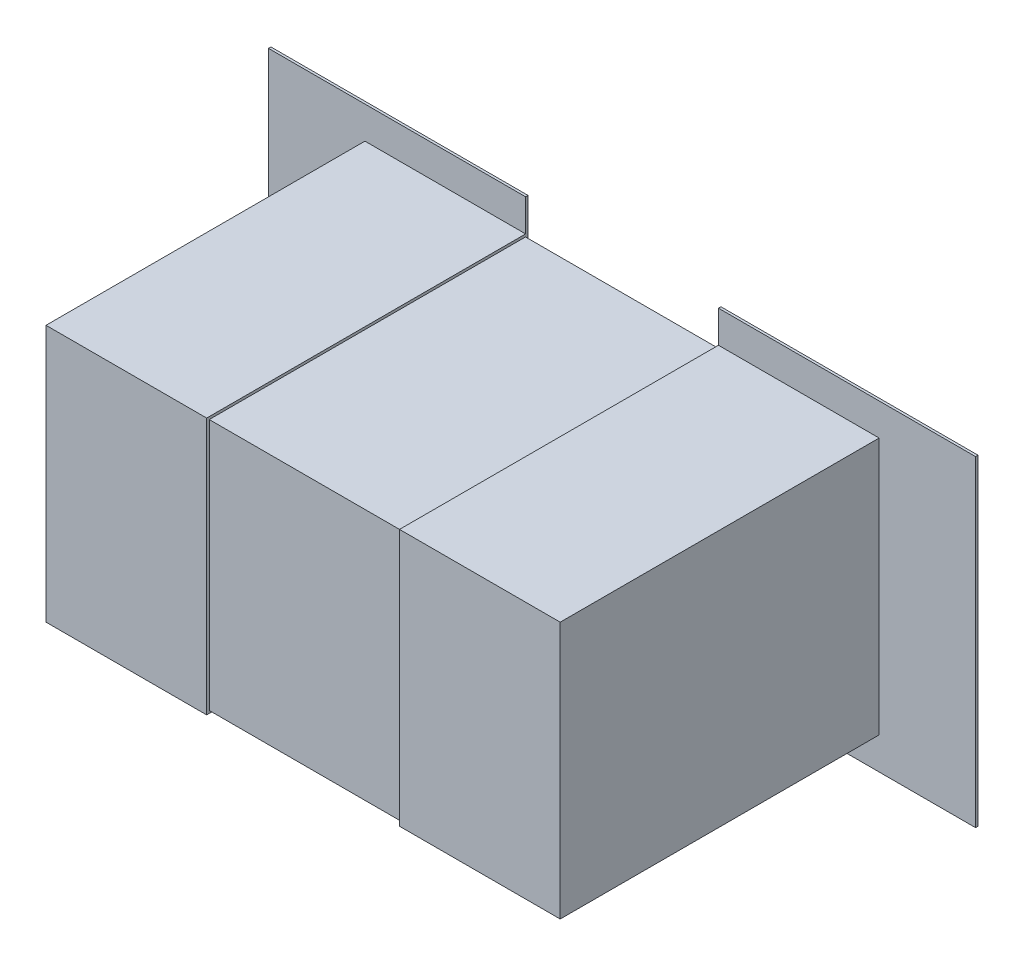
ISO-10303-21;
HEADER;
FILE_DESCRIPTION(('STEP AP214'),'2;1');
FILE_NAME('part.step','',(''),(''),'','','');
FILE_SCHEMA(('AUTOMOTIVE_DESIGN { 1 0 10303 214 1 1 1 1 }'));
ENDSEC;
DATA;
#1=APPLICATION_CONTEXT('core data for automotive mechanical design processes');
#2=APPLICATION_PROTOCOL_DEFINITION('international standard','automotive_design',2000,#1);
#3=PRODUCT_CONTEXT('',#1,'mechanical');
#4=PRODUCT('Part','Part','',(#3));
#5=PRODUCT_RELATED_PRODUCT_CATEGORY('part','',(#4));
#6=PRODUCT_DEFINITION_FORMATION('','',#4);
#7=PRODUCT_DEFINITION_CONTEXT('part definition',#1,'design');
#8=PRODUCT_DEFINITION('design','',#6,#7);
#9=PRODUCT_DEFINITION_SHAPE('','',#8);
#10=(LENGTH_UNIT() NAMED_UNIT(*) SI_UNIT(.MILLI.,.METRE.));
#11=(NAMED_UNIT(*) PLANE_ANGLE_UNIT() SI_UNIT($,.RADIAN.));
#12=(NAMED_UNIT(*) SI_UNIT($,.STERADIAN.) SOLID_ANGLE_UNIT());
#13=UNCERTAINTY_MEASURE_WITH_UNIT(LENGTH_MEASURE(1.E-05),#10,'distance_accuracy_value','');
#14=(GEOMETRIC_REPRESENTATION_CONTEXT(3) GLOBAL_UNCERTAINTY_ASSIGNED_CONTEXT((#13)) GLOBAL_UNIT_ASSIGNED_CONTEXT((#10,
#11,#12)) REPRESENTATION_CONTEXT('',''));
#15=CARTESIAN_POINT('',(0.,0.,0.));
#16=DIRECTION('',(0.,0.,1.));
#17=DIRECTION('',(1.,0.,0.));
#18=AXIS2_PLACEMENT_3D('',#15,#16,#17);
#19=CARTESIAN_POINT('',(0.800000000000102,-0.399999999999924,0.0762));
#20=DIRECTION('',(1.,0.,0.));
#21=DIRECTION('',(0.,0.,-1.));
#22=AXIS2_PLACEMENT_3D('',#19,#20,#21);
#23=PLANE('',#22);
#24=DIRECTION('',(0.,0.,-1.));
#25=VECTOR('',#24,1.);
#26=CARTESIAN_POINT('',(0.800000000000102,-0.399999999999924,0.0762));
#27=LINE('',#26,#25);
#28=CARTESIAN_POINT('',(0.800000000000102,-0.399999999999924,0.08382));
#29=VERTEX_POINT('',#28);
#30=CARTESIAN_POINT('',(0.800000000000102,-0.399999999999924,1.076198));
#31=VERTEX_POINT('',#30);
#32=EDGE_CURVE('E182',#29,#31,#27,.F.);
#33=ORIENTED_EDGE('',*,*,#32,.F.);
#34=DIRECTION('',(0.,1.,0.));
#35=VECTOR('',#34,1.);
#36=CARTESIAN_POINT('',(0.800000000000102,0.,0.08382));
#37=LINE('',#36,#35);
#38=CARTESIAN_POINT('',(0.800000000000102,0.399999999999924,0.08382));
#39=VERTEX_POINT('',#38);
#40=EDGE_CURVE('E192',#39,#29,#37,.F.);
#41=ORIENTED_EDGE('',*,*,#40,.F.);
#42=DIRECTION('',(0.,0.,1.));
#43=VECTOR('',#42,1.);
#44=CARTESIAN_POINT('',(0.800000000000102,0.399999999999924,0.0762));
#45=LINE('',#44,#43);
#46=CARTESIAN_POINT('',(0.800000000000102,0.399999999999924,1.076198));
#47=VERTEX_POINT('',#46);
#48=EDGE_CURVE('E175',#47,#39,#45,.F.);
#49=ORIENTED_EDGE('',*,*,#48,.F.);
#50=DIRECTION('',(0.,1.,0.));
#51=VECTOR('',#50,1.);
#52=CARTESIAN_POINT('',(0.800000000000102,0.,1.076198));
#53=LINE('',#52,#51);
#54=EDGE_CURVE('E150',#31,#47,#53,.T.);
#55=ORIENTED_EDGE('',*,*,#54,.F.);
#56=EDGE_LOOP('',(#33,#41,#49,#55));
#57=FACE_BOUND('',#56,.T.);
#58=ADVANCED_FACE('F17',(#57),#23,.T.);
#59=CARTESIAN_POINT('',(1.09999999999992,-0.500000000000032,0.0762));
#60=DIRECTION('',(1.,0.,0.));
#61=DIRECTION('',(0.,0.,-1.));
#62=AXIS2_PLACEMENT_3D('',#59,#60,#61);
#63=PLANE('',#62);
#64=DIRECTION('',(0.,0.,-1.));
#65=VECTOR('',#64,1.);
#66=CARTESIAN_POINT('',(1.09999999999992,-0.500000000000032,0.0762));
#67=LINE('',#66,#65);
#68=CARTESIAN_POINT('',(1.09999999999992,-0.500000000000032,0.0762));
#69=VERTEX_POINT('',#68);
#70=CARTESIAN_POINT('',(1.09999999999992,-0.500000000000032,0.08382));
#71=VERTEX_POINT('',#70);
#72=EDGE_CURVE('E168',#69,#71,#67,.F.);
#73=ORIENTED_EDGE('',*,*,#72,.F.);
#74=DIRECTION('',(0.,1.,0.));
#75=VECTOR('',#74,1.);
#76=CARTESIAN_POINT('',(1.09999999999992,0.,0.0762));
#77=LINE('',#76,#75);
#78=CARTESIAN_POINT('',(1.09999999999992,0.500000000000032,0.0762));
#79=VERTEX_POINT('',#78);
#80=EDGE_CURVE('E20',#69,#79,#77,.T.);
#81=ORIENTED_EDGE('',*,*,#80,.T.);
#82=DIRECTION('',(0.,0.,1.));
#83=VECTOR('',#82,1.);
#84=CARTESIAN_POINT('',(1.09999999999992,0.500000000000032,0.0762));
#85=LINE('',#84,#83);
#86=CARTESIAN_POINT('',(1.09999999999992,0.500000000000032,0.08382));
#87=VERTEX_POINT('',#86);
#88=EDGE_CURVE('E156',#87,#79,#85,.F.);
#89=ORIENTED_EDGE('',*,*,#88,.F.);
#90=DIRECTION('',(0.,1.,0.));
#91=VECTOR('',#90,1.);
#92=CARTESIAN_POINT('',(1.09999999999992,0.,0.08382));
#93=LINE('',#92,#91);
#94=EDGE_CURVE('E186',#71,#87,#93,.T.);
#95=ORIENTED_EDGE('',*,*,#94,.F.);
#96=EDGE_LOOP('',(#73,#81,#89,#95));
#97=FACE_BOUND('',#96,.T.);
#98=ADVANCED_FACE('F167',(#97),#63,.T.);
#99=CARTESIAN_POINT('',(0.,0.,0.0762));
#100=DIRECTION('',(0.,0.,1.));
#101=DIRECTION('',(1.,0.,0.));
#102=AXIS2_PLACEMENT_3D('',#99,#100,#101);
#103=PLANE('',#102);
#104=ORIENTED_EDGE('',*,*,#80,.F.);
#105=DIRECTION('',(1.,0.,0.));
#106=VECTOR('',#105,1.);
#107=CARTESIAN_POINT('',(0.30000000000007,-0.500000000000032,0.0762));
#108=LINE('',#107,#106);
#109=CARTESIAN_POINT('',(0.30000000000007,-0.500000000000032,0.0762));
#110=VERTEX_POINT('',#109);
#111=EDGE_CURVE('E199',#110,#69,#108,.T.);
#112=ORIENTED_EDGE('',*,*,#111,.F.);
#113=DIRECTION('',(0.,1.,0.));
#114=VECTOR('',#113,1.);
#115=CARTESIAN_POINT('',(0.30000000000007,-0.399999999999924,0.0762));
#116=LINE('',#115,#114);
#117=CARTESIAN_POINT('',(0.30000000000007,0.500000000000032,0.0762));
#118=VERTEX_POINT('',#117);
#119=EDGE_CURVE('E174',#110,#118,#116,.T.);
#120=ORIENTED_EDGE('',*,*,#119,.T.);
#121=DIRECTION('',(1.,0.,0.));
#122=VECTOR('',#121,1.);
#123=CARTESIAN_POINT('',(1.09999999999992,0.500000000000032,0.0762));
#124=LINE('',#123,#122);
#125=EDGE_CURVE('E161',#79,#118,#124,.F.);
#126=ORIENTED_EDGE('',*,*,#125,.F.);
#127=EDGE_LOOP('',(#104,#112,#120,#126));
#128=FACE_BOUND('',#127,.T.);
#129=ADVANCED_FACE('F173',(#128),#103,.F.);
#130=CARTESIAN_POINT('',(1.09999999999992,0.500000000000032,0.0762));
#131=DIRECTION('',(0.,1.,0.));
#132=DIRECTION('',(0.,0.,1.));
#133=AXIS2_PLACEMENT_3D('',#130,#131,#132);
#134=PLANE('',#133);
#135=ORIENTED_EDGE('',*,*,#88,.T.);
#136=ORIENTED_EDGE('',*,*,#125,.T.);
#137=DIRECTION('',(0.,0.,-1.));
#138=VECTOR('',#137,1.);
#139=CARTESIAN_POINT('',(0.30000000000007,0.500000000000032,0.0841999999999934));
#140=LINE('',#139,#138);
#141=CARTESIAN_POINT('',(0.30000000000007,0.500000000000032,0.08382));
#142=VERTEX_POINT('',#141);
#143=EDGE_CURVE('E202',#118,#142,#140,.F.);
#144=ORIENTED_EDGE('',*,*,#143,.T.);
#145=DIRECTION('',(1.,0.,0.));
#146=VECTOR('',#145,1.);
#147=CARTESIAN_POINT('',(0.,0.500000000000032,0.08382));
#148=LINE('',#147,#146);
#149=EDGE_CURVE('E163',#87,#142,#148,.F.);
#150=ORIENTED_EDGE('',*,*,#149,.F.);
#151=EDGE_LOOP('',(#135,#136,#144,#150));
#152=FACE_BOUND('',#151,.T.);
#153=ADVANCED_FACE('F158',(#152),#134,.T.);
#154=CARTESIAN_POINT('',(0.800000000000102,0.399999999999924,0.0762));
#155=DIRECTION('',(0.,1.,0.));
#156=DIRECTION('',(0.,0.,1.));
#157=AXIS2_PLACEMENT_3D('',#154,#155,#156);
#158=PLANE('',#157);
#159=ORIENTED_EDGE('',*,*,#48,.T.);
#160=DIRECTION('',(1.,0.,0.));
#161=VECTOR('',#160,1.);
#162=CARTESIAN_POINT('',(0.,0.399999999999924,0.08382));
#163=LINE('',#162,#161);
#164=CARTESIAN_POINT('',(0.30000000000007,0.399999999999924,0.08382));
#165=VERTEX_POINT('',#164);
#166=EDGE_CURVE('E189',#165,#39,#163,.T.);
#167=ORIENTED_EDGE('',*,*,#166,.F.);
#168=DIRECTION('',(0.,0.,-1.));
#169=VECTOR('',#168,1.);
#170=CARTESIAN_POINT('',(0.30000000000007,0.399999999999924,0.0841999999999934));
#171=LINE('',#170,#169);
#172=CARTESIAN_POINT('',(0.30000000000007,0.399999999999924,1.076198));
#173=VERTEX_POINT('',#172);
#174=EDGE_CURVE('E207',#165,#173,#171,.F.);
#175=ORIENTED_EDGE('',*,*,#174,.T.);
#176=DIRECTION('',(1.,0.,0.));
#177=VECTOR('',#176,1.);
#178=CARTESIAN_POINT('',(0.,0.399999999999924,1.076198));
#179=LINE('',#178,#177);
#180=EDGE_CURVE('E180',#47,#173,#179,.F.);
#181=ORIENTED_EDGE('',*,*,#180,.F.);
#182=EDGE_LOOP('',(#159,#167,#175,#181));
#183=FACE_BOUND('',#182,.T.);
#184=ADVANCED_FACE('F398',(#183),#158,.T.);
#185=CARTESIAN_POINT('',(0.,0.,1.076198));
#186=DIRECTION('',(0.,0.,1.));
#187=DIRECTION('',(1.,0.,0.));
#188=AXIS2_PLACEMENT_3D('',#185,#186,#187);
#189=PLANE('',#188);
#190=ORIENTED_EDGE('',*,*,#180,.T.);
#191=DIRECTION('',(0.,1.,0.));
#192=VECTOR('',#191,1.);
#193=CARTESIAN_POINT('',(0.30000000000007,-0.399999999999924,1.076198));
#194=LINE('',#193,#192);
#195=CARTESIAN_POINT('',(0.30000000000007,-0.399999999999924,1.076198));
#196=VERTEX_POINT('',#195);
#197=EDGE_CURVE('E210',#173,#196,#194,.F.);
#198=ORIENTED_EDGE('',*,*,#197,.T.);
#199=DIRECTION('',(1.,0.,0.));
#200=VECTOR('',#199,1.);
#201=CARTESIAN_POINT('',(-0.800000000000102,-0.399999999999924,1.076198));
#202=LINE('',#201,#200);
#203=EDGE_CURVE('E184',#31,#196,#202,.F.);
#204=ORIENTED_EDGE('',*,*,#203,.F.);
#205=ORIENTED_EDGE('',*,*,#54,.T.);
#206=EDGE_LOOP('',(#190,#198,#204,#205));
#207=FACE_BOUND('',#206,.T.);
#208=ADVANCED_FACE('F394',(#207),#189,.T.);
#209=CARTESIAN_POINT('',(-0.800000000000102,-0.399999999999924,0.0762));
#210=DIRECTION('',(0.,-1.,0.));
#211=DIRECTION('',(0.,0.,-1.));
#212=AXIS2_PLACEMENT_3D('',#209,#210,#211);
#213=PLANE('',#212);
#214=DIRECTION('',(0.,0.,-1.));
#215=VECTOR('',#214,1.);
#216=CARTESIAN_POINT('',(0.30000000000007,-0.399999999999924,0.0841999999999934));
#217=LINE('',#216,#215);
#218=CARTESIAN_POINT('',(0.30000000000007,-0.399999999999924,0.08382));
#219=VERTEX_POINT('',#218);
#220=EDGE_CURVE('E213',#196,#219,#217,.T.);
#221=ORIENTED_EDGE('',*,*,#220,.T.);
#222=DIRECTION('',(1.,0.,0.));
#223=VECTOR('',#222,1.);
#224=CARTESIAN_POINT('',(0.,-0.399999999999924,0.08382));
#225=LINE('',#224,#223);
#226=EDGE_CURVE('E194',#29,#219,#225,.F.);
#227=ORIENTED_EDGE('',*,*,#226,.F.);
#228=ORIENTED_EDGE('',*,*,#32,.T.);
#229=ORIENTED_EDGE('',*,*,#203,.T.);
#230=EDGE_LOOP('',(#221,#227,#228,#229));
#231=FACE_BOUND('',#230,.T.);
#232=ADVANCED_FACE('F390',(#231),#213,.T.);
#233=CARTESIAN_POINT('',(0.,0.,0.08382));
#234=DIRECTION('',(0.,0.,1.));
#235=DIRECTION('',(1.,0.,0.));
#236=AXIS2_PLACEMENT_3D('',#233,#234,#235);
#237=PLANE('',#236);
#238=ORIENTED_EDGE('',*,*,#40,.T.);
#239=ORIENTED_EDGE('',*,*,#226,.T.);
#240=DIRECTION('',(0.,1.,0.));
#241=VECTOR('',#240,1.);
#242=CARTESIAN_POINT('',(0.30000000000007,-0.399999999999924,0.08382));
#243=LINE('',#242,#241);
#244=CARTESIAN_POINT('',(0.30000000000007,-0.500000000000032,0.08382));
#245=VERTEX_POINT('',#244);
#246=EDGE_CURVE('E216',#219,#245,#243,.F.);
#247=ORIENTED_EDGE('',*,*,#246,.T.);
#248=DIRECTION('',(1.,0.,0.));
#249=VECTOR('',#248,1.);
#250=CARTESIAN_POINT('',(0.30000000000007,-0.500000000000032,0.08382));
#251=LINE('',#250,#249);
#252=EDGE_CURVE('E197',#71,#245,#251,.F.);
#253=ORIENTED_EDGE('',*,*,#252,.F.);
#254=ORIENTED_EDGE('',*,*,#94,.T.);
#255=ORIENTED_EDGE('',*,*,#149,.T.);
#256=DIRECTION('',(0.,1.,0.));
#257=VECTOR('',#256,1.);
#258=CARTESIAN_POINT('',(0.30000000000007,-0.399999999999924,0.08382));
#259=LINE('',#258,#257);
#260=EDGE_CURVE('E204',#142,#165,#259,.F.);
#261=ORIENTED_EDGE('',*,*,#260,.T.);
#262=ORIENTED_EDGE('',*,*,#166,.T.);
#263=EDGE_LOOP('',(#238,#239,#247,#253,#254,#255,#261,#262));
#264=FACE_BOUND('',#263,.T.);
#265=ADVANCED_FACE('F386',(#264),#237,.T.);
#266=CARTESIAN_POINT('',(0.30000000000007,-0.500000000000032,0.0762));
#267=DIRECTION('',(0.,-1.,0.));
#268=DIRECTION('',(0.,0.,-1.));
#269=AXIS2_PLACEMENT_3D('',#266,#267,#268);
#270=PLANE('',#269);
#271=DIRECTION('',(0.,0.,-1.));
#272=VECTOR('',#271,1.);
#273=CARTESIAN_POINT('',(0.30000000000007,-0.500000000000032,0.0841999999999934));
#274=LINE('',#273,#272);
#275=EDGE_CURVE('E219',#245,#110,#274,.T.);
#276=ORIENTED_EDGE('',*,*,#275,.T.);
#277=ORIENTED_EDGE('',*,*,#111,.T.);
#278=ORIENTED_EDGE('',*,*,#72,.T.);
#279=ORIENTED_EDGE('',*,*,#252,.T.);
#280=EDGE_LOOP('',(#276,#277,#278,#279));
#281=FACE_BOUND('',#280,.T.);
#282=ADVANCED_FACE('F382',(#281),#270,.T.);
#283=CARTESIAN_POINT('',(0.30000000000007,-0.399999999999924,0.0841999999999934));
#284=DIRECTION('',(1.,0.,0.));
#285=DIRECTION('',(0.,0.,-1.));
#286=AXIS2_PLACEMENT_3D('',#283,#284,#285);
#287=PLANE('',#286);
#288=DIRECTION('',(0.,1.,0.));
#289=VECTOR('',#288,1.);
#290=CARTESIAN_POINT('',(0.30000000000007,0.399999999999924,1.06819800000003));
#291=LINE('',#290,#289);
#292=CARTESIAN_POINT('',(0.30000000000007,0.391999999999956,1.06819800000003));
#293=VERTEX_POINT('',#292);
#294=CARTESIAN_POINT('',(0.30000000000007,-0.391999999999956,1.06819800000003));
#295=VERTEX_POINT('',#294);
#296=EDGE_CURVE('E248',#293,#295,#291,.F.);
#297=ORIENTED_EDGE('',*,*,#296,.T.);
#298=DIRECTION('',(0.,0.,1.));
#299=VECTOR('',#298,1.);
#300=CARTESIAN_POINT('',(0.30000000000007,-0.391999999999956,1.076198));
#301=LINE('',#300,#299);
#302=CARTESIAN_POINT('',(0.30000000000007,-0.391999999999956,0.0841999999999934));
#303=VERTEX_POINT('',#302);
#304=EDGE_CURVE('E233',#295,#303,#301,.F.);
#305=ORIENTED_EDGE('',*,*,#304,.T.);
#306=DIRECTION('',(0.,1.,0.));
#307=VECTOR('',#306,1.);
#308=CARTESIAN_POINT('',(0.30000000000007,-0.399999999999924,0.0841999999999934));
#309=LINE('',#308,#307);
#310=CARTESIAN_POINT('',(0.30000000000007,0.391999999999956,0.0841999999999934));
#311=VERTEX_POINT('',#310);
#312=EDGE_CURVE('E238',#303,#311,#309,.T.);
#313=ORIENTED_EDGE('',*,*,#312,.T.);
#314=DIRECTION('',(0.,0.,-1.));
#315=VECTOR('',#314,1.);
#316=CARTESIAN_POINT('',(0.30000000000007,0.391999999999956,0.0762));
#317=LINE('',#316,#315);
#318=EDGE_CURVE('E243',#311,#293,#317,.F.);
#319=ORIENTED_EDGE('',*,*,#318,.T.);
#320=EDGE_LOOP('',(#297,#305,#313,#319));
#321=FACE_BOUND('',#320,.T.);
#322=ORIENTED_EDGE('',*,*,#246,.F.);
#323=ORIENTED_EDGE('',*,*,#220,.F.);
#324=ORIENTED_EDGE('',*,*,#197,.F.);
#325=ORIENTED_EDGE('',*,*,#174,.F.);
#326=ORIENTED_EDGE('',*,*,#260,.F.);
#327=ORIENTED_EDGE('',*,*,#143,.F.);
#328=ORIENTED_EDGE('',*,*,#119,.F.);
#329=ORIENTED_EDGE('',*,*,#275,.F.);
#330=EDGE_LOOP('',(#322,#323,#324,#325,#326,#327,#328,#329));
#331=FACE_BOUND('',#330,.T.);
#332=ADVANCED_FACE('F378',(#321,#331),#287,.F.);
#333=CARTESIAN_POINT('',(-0.800000000000102,0.399999999999924,0.0762));
#334=DIRECTION('',(-1.,0.,0.));
#335=DIRECTION('',(0.,0.,1.));
#336=AXIS2_PLACEMENT_3D('',#333,#334,#335);
#337=PLANE('',#336);
#338=DIRECTION('',(0.,0.,1.));
#339=VECTOR('',#338,1.);
#340=CARTESIAN_POINT('',(-0.800000000000102,0.399999999999924,0.0762));
#341=LINE('',#340,#339);
#342=CARTESIAN_POINT('',(-0.800000000000102,0.399999999999924,0.08382));
#343=VERTEX_POINT('',#342);
#344=CARTESIAN_POINT('',(-0.800000000000102,0.399999999999924,1.076198));
#345=VERTEX_POINT('',#344);
#346=EDGE_CURVE('E222',#343,#345,#341,.T.);
#347=ORIENTED_EDGE('',*,*,#346,.F.);
#348=DIRECTION('',(0.,1.,0.));
#349=VECTOR('',#348,1.);
#350=CARTESIAN_POINT('',(-0.800000000000102,0.,0.08382));
#351=LINE('',#350,#349);
#352=CARTESIAN_POINT('',(-0.800000000000102,-0.399999999999924,0.08382));
#353=VERTEX_POINT('',#352);
#354=EDGE_CURVE('E259',#353,#343,#351,.T.);
#355=ORIENTED_EDGE('',*,*,#354,.F.);
#356=DIRECTION('',(0.,0.,-1.));
#357=VECTOR('',#356,1.);
#358=CARTESIAN_POINT('',(-0.800000000000102,-0.399999999999924,0.0762));
#359=LINE('',#358,#357);
#360=CARTESIAN_POINT('',(-0.800000000000102,-0.399999999999924,1.076198));
#361=VERTEX_POINT('',#360);
#362=EDGE_CURVE('E224',#361,#353,#359,.T.);
#363=ORIENTED_EDGE('',*,*,#362,.F.);
#364=DIRECTION('',(0.,1.,0.));
#365=VECTOR('',#364,1.);
#366=CARTESIAN_POINT('',(-0.800000000000102,0.,1.076198));
#367=LINE('',#366,#365);
#368=EDGE_CURVE('E229',#345,#361,#367,.F.);
#369=ORIENTED_EDGE('',*,*,#368,.F.);
#370=EDGE_LOOP('',(#347,#355,#363,#369));
#371=FACE_BOUND('',#370,.T.);
#372=ADVANCED_FACE('F374',(#371),#337,.T.);
#373=CARTESIAN_POINT('',(0.800000000000102,0.399999999999924,0.0762));
#374=DIRECTION('',(0.,1.,0.));
#375=DIRECTION('',(0.,0.,1.));
#376=AXIS2_PLACEMENT_3D('',#373,#374,#375);
#377=PLANE('',#376);
#378=DIRECTION('',(0.,0.,1.));
#379=VECTOR('',#378,1.);
#380=CARTESIAN_POINT('',(-0.30000000000007,0.399999999999924,0.0762));
#381=LINE('',#380,#379);
#382=CARTESIAN_POINT('',(-0.30000000000007,0.399999999999924,1.076198));
#383=VERTEX_POINT('',#382);
#384=CARTESIAN_POINT('',(-0.30000000000007,0.399999999999924,0.08382));
#385=VERTEX_POINT('',#384);
#386=EDGE_CURVE('E262',#383,#385,#381,.F.);
#387=ORIENTED_EDGE('',*,*,#386,.T.);
#388=DIRECTION('',(1.,0.,0.));
#389=VECTOR('',#388,1.);
#390=CARTESIAN_POINT('',(0.,0.399999999999924,0.08382));
#391=LINE('',#390,#389);
#392=EDGE_CURVE('E254',#343,#385,#391,.T.);
#393=ORIENTED_EDGE('',*,*,#392,.F.);
#394=ORIENTED_EDGE('',*,*,#346,.T.);
#395=DIRECTION('',(1.,0.,0.));
#396=VECTOR('',#395,1.);
#397=CARTESIAN_POINT('',(0.,0.399999999999924,1.076198));
#398=LINE('',#397,#396);
#399=EDGE_CURVE('E226',#383,#345,#398,.F.);
#400=ORIENTED_EDGE('',*,*,#399,.F.);
#401=EDGE_LOOP('',(#387,#393,#394,#400));
#402=FACE_BOUND('',#401,.T.);
#403=ADVANCED_FACE('F370',(#402),#377,.T.);
#404=CARTESIAN_POINT('',(-0.800000000000102,-0.399999999999924,0.0762));
#405=DIRECTION('',(0.,-1.,0.));
#406=DIRECTION('',(0.,0.,-1.));
#407=AXIS2_PLACEMENT_3D('',#404,#405,#406);
#408=PLANE('',#407);
#409=ORIENTED_EDGE('',*,*,#362,.T.);
#410=DIRECTION('',(1.,0.,0.));
#411=VECTOR('',#410,1.);
#412=CARTESIAN_POINT('',(0.,-0.399999999999924,0.08382));
#413=LINE('',#412,#411);
#414=CARTESIAN_POINT('',(-0.30000000000007,-0.399999999999924,0.08382));
#415=VERTEX_POINT('',#414);
#416=EDGE_CURVE('E256',#415,#353,#413,.F.);
#417=ORIENTED_EDGE('',*,*,#416,.F.);
#418=DIRECTION('',(0.,0.,1.));
#419=VECTOR('',#418,1.);
#420=CARTESIAN_POINT('',(-0.30000000000007,-0.399999999999924,0.0762));
#421=LINE('',#420,#419);
#422=CARTESIAN_POINT('',(-0.30000000000007,-0.399999999999924,1.076198));
#423=VERTEX_POINT('',#422);
#424=EDGE_CURVE('E271',#415,#423,#421,.T.);
#425=ORIENTED_EDGE('',*,*,#424,.T.);
#426=DIRECTION('',(1.,0.,0.));
#427=VECTOR('',#426,1.);
#428=CARTESIAN_POINT('',(0.,-0.399999999999924,1.076198));
#429=LINE('',#428,#427);
#430=EDGE_CURVE('E231',#361,#423,#429,.T.);
#431=ORIENTED_EDGE('',*,*,#430,.F.);
#432=EDGE_LOOP('',(#409,#417,#425,#431));
#433=FACE_BOUND('',#432,.T.);
#434=ADVANCED_FACE('F366',(#433),#408,.T.);
#435=CARTESIAN_POINT('',(0.,0.,1.076198));
#436=DIRECTION('',(0.,0.,1.));
#437=DIRECTION('',(1.,0.,0.));
#438=AXIS2_PLACEMENT_3D('',#435,#436,#437);
#439=PLANE('',#438);
#440=ORIENTED_EDGE('',*,*,#430,.T.);
#441=DIRECTION('',(0.,1.,0.));
#442=VECTOR('',#441,1.);
#443=CARTESIAN_POINT('',(-0.30000000000007,-0.399999999999924,1.076198));
#444=LINE('',#443,#442);
#445=EDGE_CURVE('E274',#423,#383,#444,.T.);
#446=ORIENTED_EDGE('',*,*,#445,.T.);
#447=ORIENTED_EDGE('',*,*,#399,.T.);
#448=ORIENTED_EDGE('',*,*,#368,.T.);
#449=EDGE_LOOP('',(#440,#446,#447,#448));
#450=FACE_BOUND('',#449,.T.);
#451=ADVANCED_FACE('F362',(#450),#439,.T.);
#452=CARTESIAN_POINT('',(-0.30000000000007,-0.391999999999956,1.076198));
#453=DIRECTION('',(0.,1.,0.));
#454=DIRECTION('',(0.,0.,1.));
#455=AXIS2_PLACEMENT_3D('',#452,#453,#454);
#456=PLANE('',#455);
#457=DIRECTION('',(1.,0.,0.));
#458=VECTOR('',#457,1.);
#459=CARTESIAN_POINT('',(-0.30000000000007,-0.391999999999956,0.0841999999999934));
#460=LINE('',#459,#458);
#461=CARTESIAN_POINT('',(-0.30000000000007,-0.391999999999956,0.0841999999999934));
#462=VERTEX_POINT('',#461);
#463=EDGE_CURVE('E235',#462,#303,#460,.T.);
#464=ORIENTED_EDGE('',*,*,#463,.T.);
#465=ORIENTED_EDGE('',*,*,#304,.F.);
#466=DIRECTION('',(-1.,0.,0.));
#467=VECTOR('',#466,1.);
#468=CARTESIAN_POINT('',(-0.30000000000007,-0.391999999999956,1.06819800000003));
#469=LINE('',#468,#467);
#470=CARTESIAN_POINT('',(-0.30000000000007,-0.391999999999956,1.06819800000003));
#471=VERTEX_POINT('',#470);
#472=EDGE_CURVE('E251',#295,#471,#469,.T.);
#473=ORIENTED_EDGE('',*,*,#472,.T.);
#474=DIRECTION('',(0.,0.,1.));
#475=VECTOR('',#474,1.);
#476=CARTESIAN_POINT('',(-0.30000000000007,-0.391999999999956,0.0762));
#477=LINE('',#476,#475);
#478=EDGE_CURVE('E277',#471,#462,#477,.F.);
#479=ORIENTED_EDGE('',*,*,#478,.T.);
#480=EDGE_LOOP('',(#464,#465,#473,#479));
#481=FACE_BOUND('',#480,.T.);
#482=ADVANCED_FACE('F358',(#481),#456,.F.);
#483=CARTESIAN_POINT('',(-0.30000000000007,-0.399999999999924,0.0841999999999934));
#484=DIRECTION('',(0.,0.,1.));
#485=DIRECTION('',(1.,0.,0.));
#486=AXIS2_PLACEMENT_3D('',#483,#484,#485);
#487=PLANE('',#486);
#488=DIRECTION('',(1.,0.,0.));
#489=VECTOR('',#488,1.);
#490=CARTESIAN_POINT('',(-0.30000000000007,0.391999999999956,0.0841999999999934));
#491=LINE('',#490,#489);
#492=CARTESIAN_POINT('',(-0.30000000000007,0.391999999999956,0.0841999999999934));
#493=VERTEX_POINT('',#492);
#494=EDGE_CURVE('E240',#493,#311,#491,.T.);
#495=ORIENTED_EDGE('',*,*,#494,.T.);
#496=ORIENTED_EDGE('',*,*,#312,.F.);
#497=ORIENTED_EDGE('',*,*,#463,.F.);
#498=DIRECTION('',(0.,1.,0.));
#499=VECTOR('',#498,1.);
#500=CARTESIAN_POINT('',(-0.30000000000007,-0.399999999999924,0.0841999999999934));
#501=LINE('',#500,#499);
#502=EDGE_CURVE('E280',#462,#493,#501,.T.);
#503=ORIENTED_EDGE('',*,*,#502,.T.);
#504=EDGE_LOOP('',(#495,#496,#497,#503));
#505=FACE_BOUND('',#504,.T.);
#506=ADVANCED_FACE('F354',(#505),#487,.F.);
#507=CARTESIAN_POINT('',(-0.30000000000007,0.391999999999956,0.0762));
#508=DIRECTION('',(0.,-1.,0.));
#509=DIRECTION('',(0.,0.,-1.));
#510=AXIS2_PLACEMENT_3D('',#507,#508,#509);
#511=PLANE('',#510);
#512=DIRECTION('',(-1.,0.,0.));
#513=VECTOR('',#512,1.);
#514=CARTESIAN_POINT('',(-0.30000000000007,0.391999999999956,1.06819800000003));
#515=LINE('',#514,#513);
#516=CARTESIAN_POINT('',(-0.30000000000007,0.391999999999956,1.06819800000003));
#517=VERTEX_POINT('',#516);
#518=EDGE_CURVE('E245',#517,#293,#515,.F.);
#519=ORIENTED_EDGE('',*,*,#518,.T.);
#520=ORIENTED_EDGE('',*,*,#318,.F.);
#521=ORIENTED_EDGE('',*,*,#494,.F.);
#522=DIRECTION('',(0.,0.,1.));
#523=VECTOR('',#522,1.);
#524=CARTESIAN_POINT('',(-0.30000000000007,0.391999999999956,0.0762));
#525=LINE('',#524,#523);
#526=EDGE_CURVE('E283',#493,#517,#525,.T.);
#527=ORIENTED_EDGE('',*,*,#526,.T.);
#528=EDGE_LOOP('',(#519,#520,#521,#527));
#529=FACE_BOUND('',#528,.T.);
#530=ADVANCED_FACE('F350',(#529),#511,.F.);
#531=CARTESIAN_POINT('',(-0.30000000000007,0.399999999999924,1.06819800000003));
#532=DIRECTION('',(0.,0.,-1.));
#533=DIRECTION('',(-1.,0.,0.));
#534=AXIS2_PLACEMENT_3D('',#531,#532,#533);
#535=PLANE('',#534);
#536=ORIENTED_EDGE('',*,*,#472,.F.);
#537=ORIENTED_EDGE('',*,*,#296,.F.);
#538=ORIENTED_EDGE('',*,*,#518,.F.);
#539=DIRECTION('',(0.,1.,0.));
#540=VECTOR('',#539,1.);
#541=CARTESIAN_POINT('',(-0.30000000000007,-0.399999999999924,1.06819800000003));
#542=LINE('',#541,#540);
#543=EDGE_CURVE('E286',#517,#471,#542,.F.);
#544=ORIENTED_EDGE('',*,*,#543,.T.);
#545=EDGE_LOOP('',(#536,#537,#538,#544));
#546=FACE_BOUND('',#545,.T.);
#547=ADVANCED_FACE('F346',(#546),#535,.F.);
#548=CARTESIAN_POINT('',(0.,0.,0.08382));
#549=DIRECTION('',(0.,0.,1.));
#550=DIRECTION('',(1.,0.,0.));
#551=AXIS2_PLACEMENT_3D('',#548,#549,#550);
#552=PLANE('',#551);
#553=ORIENTED_EDGE('',*,*,#416,.T.);
#554=ORIENTED_EDGE('',*,*,#354,.T.);
#555=ORIENTED_EDGE('',*,*,#392,.T.);
#556=DIRECTION('',(0.,1.,0.));
#557=VECTOR('',#556,1.);
#558=CARTESIAN_POINT('',(-0.30000000000007,-0.399999999999924,0.08382));
#559=LINE('',#558,#557);
#560=CARTESIAN_POINT('',(-0.30000000000007,0.500000000000032,0.08382));
#561=VERTEX_POINT('',#560);
#562=EDGE_CURVE('E265',#385,#561,#559,.T.);
#563=ORIENTED_EDGE('',*,*,#562,.T.);
#564=DIRECTION('',(1.,0.,0.));
#565=VECTOR('',#564,1.);
#566=CARTESIAN_POINT('',(-0.30000000000007,0.500000000000032,0.08382));
#567=LINE('',#566,#565);
#568=CARTESIAN_POINT('',(-1.09999999999992,0.500000000000032,0.08382));
#569=VERTEX_POINT('',#568);
#570=EDGE_CURVE('E289',#569,#561,#567,.T.);
#571=ORIENTED_EDGE('',*,*,#570,.F.);
#572=DIRECTION('',(0.,1.,0.));
#573=VECTOR('',#572,1.);
#574=CARTESIAN_POINT('',(-1.09999999999992,0.500000000000032,0.08382));
#575=LINE('',#574,#573);
#576=CARTESIAN_POINT('',(-1.09999999999992,-0.500000000000032,0.08382));
#577=VERTEX_POINT('',#576);
#578=EDGE_CURVE('E293',#577,#569,#575,.T.);
#579=ORIENTED_EDGE('',*,*,#578,.F.);
#580=DIRECTION('',(1.,0.,0.));
#581=VECTOR('',#580,1.);
#582=CARTESIAN_POINT('',(-1.09999999999992,-0.500000000000032,0.08382));
#583=LINE('',#582,#581);
#584=CARTESIAN_POINT('',(-0.30000000000007,-0.500000000000032,0.08382));
#585=VERTEX_POINT('',#584);
#586=EDGE_CURVE('E300',#585,#577,#583,.F.);
#587=ORIENTED_EDGE('',*,*,#586,.F.);
#588=DIRECTION('',(0.,1.,0.));
#589=VECTOR('',#588,1.);
#590=CARTESIAN_POINT('',(-0.30000000000007,-0.399999999999924,0.08382));
#591=LINE('',#590,#589);
#592=EDGE_CURVE('E268',#585,#415,#591,.T.);
#593=ORIENTED_EDGE('',*,*,#592,.T.);
#594=EDGE_LOOP('',(#553,#554,#555,#563,#571,#579,#587,#593));
#595=FACE_BOUND('',#594,.T.);
#596=ADVANCED_FACE('F342',(#595),#552,.T.);
#597=CARTESIAN_POINT('',(-0.30000000000007,-0.399999999999924,0.0762));
#598=DIRECTION('',(-1.,0.,0.));
#599=DIRECTION('',(0.,0.,1.));
#600=AXIS2_PLACEMENT_3D('',#597,#598,#599);
#601=PLANE('',#600);
#602=ORIENTED_EDGE('',*,*,#526,.F.);
#603=ORIENTED_EDGE('',*,*,#502,.F.);
#604=ORIENTED_EDGE('',*,*,#478,.F.);
#605=ORIENTED_EDGE('',*,*,#543,.F.);
#606=EDGE_LOOP('',(#602,#603,#604,#605));
#607=FACE_BOUND('',#606,.T.);
#608=ORIENTED_EDGE('',*,*,#424,.F.);
#609=ORIENTED_EDGE('',*,*,#592,.F.);
#610=DIRECTION('',(0.,0.,-1.));
#611=VECTOR('',#610,1.);
#612=CARTESIAN_POINT('',(-0.30000000000007,-0.500000000000032,0.0762));
#613=LINE('',#612,#611);
#614=CARTESIAN_POINT('',(-0.30000000000007,-0.500000000000032,0.0762));
#615=VERTEX_POINT('',#614);
#616=EDGE_CURVE('E297',#615,#585,#613,.F.);
#617=ORIENTED_EDGE('',*,*,#616,.F.);
#618=DIRECTION('',(0.,1.,0.));
#619=VECTOR('',#618,1.);
#620=CARTESIAN_POINT('',(-0.30000000000007,0.,0.0762));
#621=LINE('',#620,#619);
#622=CARTESIAN_POINT('',(-0.30000000000007,0.500000000000032,0.0762));
#623=VERTEX_POINT('',#622);
#624=EDGE_CURVE('E303',#615,#623,#621,.T.);
#625=ORIENTED_EDGE('',*,*,#624,.T.);
#626=DIRECTION('',(0.,0.,1.));
#627=VECTOR('',#626,1.);
#628=CARTESIAN_POINT('',(-0.30000000000007,0.500000000000032,0.0762));
#629=LINE('',#628,#627);
#630=EDGE_CURVE('E291',#561,#623,#629,.F.);
#631=ORIENTED_EDGE('',*,*,#630,.F.);
#632=ORIENTED_EDGE('',*,*,#562,.F.);
#633=ORIENTED_EDGE('',*,*,#386,.F.);
#634=ORIENTED_EDGE('',*,*,#445,.F.);
#635=EDGE_LOOP('',(#608,#609,#617,#625,#631,#632,#633,#634));
#636=FACE_BOUND('',#635,.T.);
#637=ADVANCED_FACE('F324',(#607,#636),#601,.F.);
#638=CARTESIAN_POINT('',(-0.30000000000007,0.500000000000032,0.0762));
#639=DIRECTION('',(0.,1.,0.));
#640=DIRECTION('',(0.,0.,1.));
#641=AXIS2_PLACEMENT_3D('',#638,#639,#640);
#642=PLANE('',#641);
#643=ORIENTED_EDGE('',*,*,#630,.T.);
#644=DIRECTION('',(1.,0.,0.));
#645=VECTOR('',#644,1.);
#646=CARTESIAN_POINT('',(0.,0.500000000000032,0.0762));
#647=LINE('',#646,#645);
#648=CARTESIAN_POINT('',(-1.09999999999992,0.500000000000032,0.0762));
#649=VERTEX_POINT('',#648);
#650=EDGE_CURVE('E306',#623,#649,#647,.F.);
#651=ORIENTED_EDGE('',*,*,#650,.T.);
#652=DIRECTION('',(0.,0.,1.));
#653=VECTOR('',#652,1.);
#654=CARTESIAN_POINT('',(-1.09999999999992,0.500000000000032,0.0762));
#655=LINE('',#654,#653);
#656=EDGE_CURVE('E295',#569,#649,#655,.F.);
#657=ORIENTED_EDGE('',*,*,#656,.F.);
#658=ORIENTED_EDGE('',*,*,#570,.T.);
#659=EDGE_LOOP('',(#643,#651,#657,#658));
#660=FACE_BOUND('',#659,.T.);
#661=ADVANCED_FACE('F318',(#660),#642,.T.);
#662=CARTESIAN_POINT('',(-1.09999999999992,0.500000000000032,0.0762));
#663=DIRECTION('',(-1.,0.,0.));
#664=DIRECTION('',(0.,0.,1.));
#665=AXIS2_PLACEMENT_3D('',#662,#663,#664);
#666=PLANE('',#665);
#667=ORIENTED_EDGE('',*,*,#656,.T.);
#668=DIRECTION('',(0.,1.,0.));
#669=VECTOR('',#668,1.);
#670=CARTESIAN_POINT('',(-1.09999999999992,0.,0.0762));
#671=LINE('',#670,#669);
#672=CARTESIAN_POINT('',(-1.09999999999992,-0.500000000000032,0.0762));
#673=VERTEX_POINT('',#672);
#674=EDGE_CURVE('E26',#649,#673,#671,.F.);
#675=ORIENTED_EDGE('',*,*,#674,.T.);
#676=DIRECTION('',(0.,0.,-1.));
#677=VECTOR('',#676,1.);
#678=CARTESIAN_POINT('',(-1.09999999999992,-0.500000000000032,0.0762));
#679=LINE('',#678,#677);
#680=EDGE_CURVE('E34',#577,#673,#679,.T.);
#681=ORIENTED_EDGE('',*,*,#680,.F.);
#682=ORIENTED_EDGE('',*,*,#578,.T.);
#683=EDGE_LOOP('',(#667,#675,#681,#682));
#684=FACE_BOUND('',#683,.T.);
#685=ADVANCED_FACE('F312',(#684),#666,.T.);
#686=CARTESIAN_POINT('',(-1.09999999999992,-0.500000000000032,0.0762));
#687=DIRECTION('',(0.,-1.,0.));
#688=DIRECTION('',(0.,0.,-1.));
#689=AXIS2_PLACEMENT_3D('',#686,#687,#688);
#690=PLANE('',#689);
#691=ORIENTED_EDGE('',*,*,#680,.T.);
#692=DIRECTION('',(1.,0.,0.));
#693=VECTOR('',#692,1.);
#694=CARTESIAN_POINT('',(0.,-0.500000000000032,0.0762));
#695=LINE('',#694,#693);
#696=EDGE_CURVE('E11',#673,#615,#695,.T.);
#697=ORIENTED_EDGE('',*,*,#696,.T.);
#698=ORIENTED_EDGE('',*,*,#616,.T.);
#699=ORIENTED_EDGE('',*,*,#586,.T.);
#700=EDGE_LOOP('',(#691,#697,#698,#699));
#701=FACE_BOUND('',#700,.T.);
#702=ADVANCED_FACE('F327',(#701),#690,.T.);
#703=CARTESIAN_POINT('',(0.,0.,0.0762));
#704=DIRECTION('',(0.,0.,1.));
#705=DIRECTION('',(1.,0.,0.));
#706=AXIS2_PLACEMENT_3D('',#703,#704,#705);
#707=PLANE('',#706);
#708=ORIENTED_EDGE('',*,*,#674,.F.);
#709=ORIENTED_EDGE('',*,*,#650,.F.);
#710=ORIENTED_EDGE('',*,*,#624,.F.);
#711=ORIENTED_EDGE('',*,*,#696,.F.);
#712=EDGE_LOOP('',(#708,#709,#710,#711));
#713=FACE_BOUND('',#712,.T.);
#714=ADVANCED_FACE('F316',(#713),#707,.F.);
#715=CLOSED_SHELL('',(#58,#98,#129,#153,#184,#208,#232,#265,#282,#332,#372,#403,#434,#451,#482,
#506,#530,#547,#596,#637,#661,#685,#702,#714));
#716=MANIFOLD_SOLID_BREP('B1',#715);
#717=ADVANCED_BREP_SHAPE_REPRESENTATION('',(#18,#716),#14);
#718=SHAPE_DEFINITION_REPRESENTATION(#9,#717);
ENDSEC;
END-ISO-10303-21;
